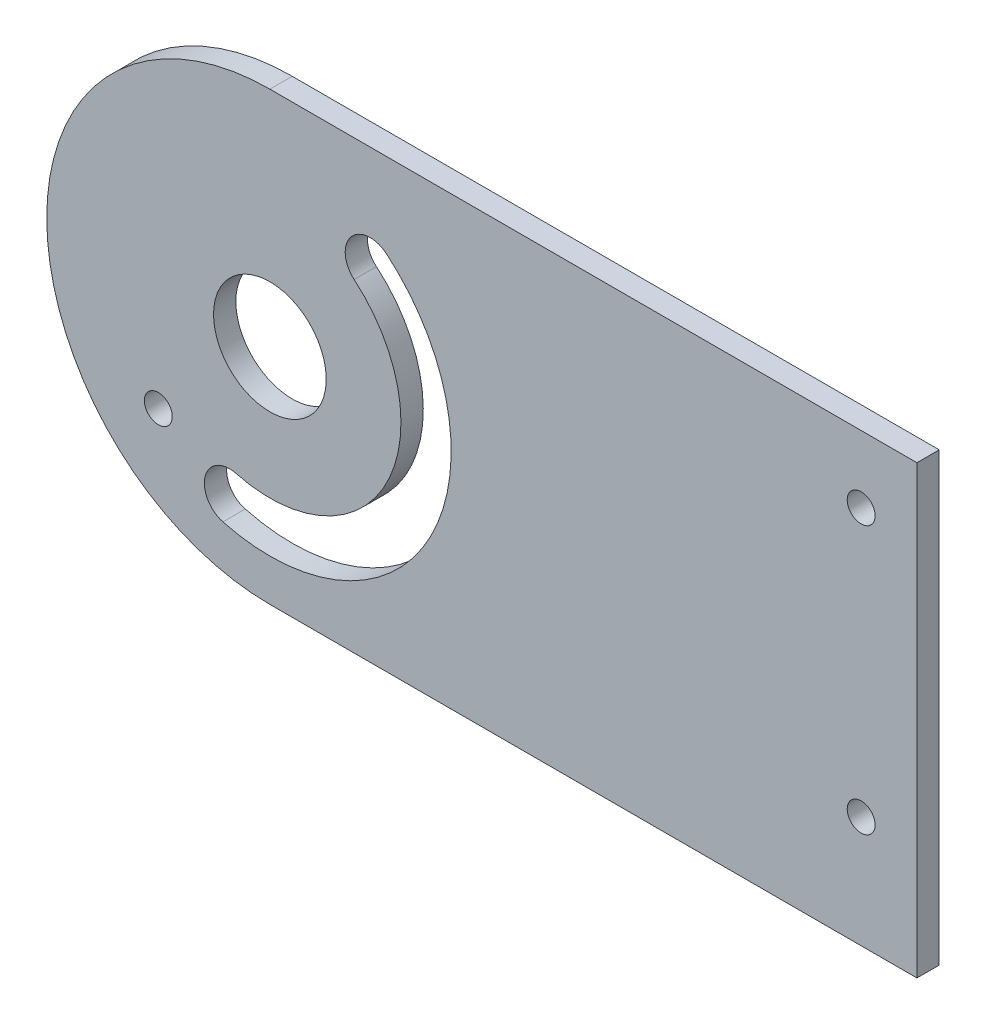
ISO-10303-21;
HEADER;
FILE_DESCRIPTION(('STEP AP214'),'2;1');
FILE_NAME('part.step','',(''),(''),'','','');
FILE_SCHEMA(('AUTOMOTIVE_DESIGN { 1 0 10303 214 1 1 1 1 }'));
ENDSEC;
DATA;
#1=APPLICATION_CONTEXT('core data for automotive mechanical design processes');
#2=APPLICATION_PROTOCOL_DEFINITION('international standard','automotive_design',2000,#1);
#3=PRODUCT_CONTEXT('',#1,'mechanical');
#4=PRODUCT('Part','Part','',(#3));
#5=PRODUCT_RELATED_PRODUCT_CATEGORY('part','',(#4));
#6=PRODUCT_DEFINITION_FORMATION('','',#4);
#7=PRODUCT_DEFINITION_CONTEXT('part definition',#1,'design');
#8=PRODUCT_DEFINITION('design','',#6,#7);
#9=PRODUCT_DEFINITION_SHAPE('','',#8);
#10=(LENGTH_UNIT() NAMED_UNIT(*) SI_UNIT(.MILLI.,.METRE.));
#11=(NAMED_UNIT(*) PLANE_ANGLE_UNIT() SI_UNIT($,.RADIAN.));
#12=(NAMED_UNIT(*) SI_UNIT($,.STERADIAN.) SOLID_ANGLE_UNIT());
#13=UNCERTAINTY_MEASURE_WITH_UNIT(LENGTH_MEASURE(1.E-05),#10,'distance_accuracy_value','');
#14=(GEOMETRIC_REPRESENTATION_CONTEXT(3) GLOBAL_UNCERTAINTY_ASSIGNED_CONTEXT((#13)) GLOBAL_UNIT_ASSIGNED_CONTEXT((#10,
#11,#12)) REPRESENTATION_CONTEXT('',''));
#15=CARTESIAN_POINT('',(0.,0.,0.));
#16=DIRECTION('',(0.,0.,1.));
#17=DIRECTION('',(1.,0.,0.));
#18=AXIS2_PLACEMENT_3D('',#15,#16,#17);
#19=CARTESIAN_POINT('',(78.,0.,2.));
#20=DIRECTION('',(0.,1.,0.));
#21=DIRECTION('',(-1.,0.,0.));
#22=AXIS2_PLACEMENT_3D('',#19,#20,#21);
#23=PLANE('',#22);
#24=DIRECTION('',(1.,0.,0.));
#25=VECTOR('',#24,1.);
#26=CARTESIAN_POINT('',(78.,0.,2.));
#27=LINE('',#26,#25);
#28=CARTESIAN_POINT('',(20.,0.,2.));
#29=VERTEX_POINT('',#28);
#30=CARTESIAN_POINT('',(78.,0.,2.));
#31=VERTEX_POINT('',#30);
#32=EDGE_CURVE('E187',#29,#31,#27,.T.);
#33=ORIENTED_EDGE('',*,*,#32,.F.);
#34=DIRECTION('',(0.,0.,-1.));
#35=VECTOR('',#34,1.);
#36=CARTESIAN_POINT('',(20.,0.,2.));
#37=LINE('',#36,#35);
#38=CARTESIAN_POINT('',(20.,0.,0.));
#39=VERTEX_POINT('',#38);
#40=EDGE_CURVE('E212',#29,#39,#37,.T.);
#41=ORIENTED_EDGE('',*,*,#40,.T.);
#42=DIRECTION('',(1.,0.,0.));
#43=VECTOR('',#42,1.);
#44=CARTESIAN_POINT('',(78.,0.,0.));
#45=LINE('',#44,#43);
#46=CARTESIAN_POINT('',(78.,0.,0.));
#47=VERTEX_POINT('',#46);
#48=EDGE_CURVE('E185',#39,#47,#45,.T.);
#49=ORIENTED_EDGE('',*,*,#48,.T.);
#50=DIRECTION('',(0.,0.,-1.));
#51=VECTOR('',#50,1.);
#52=CARTESIAN_POINT('',(78.,0.,2.));
#53=LINE('',#52,#51);
#54=EDGE_CURVE('E208',#31,#47,#53,.T.);
#55=ORIENTED_EDGE('',*,*,#54,.F.);
#56=EDGE_LOOP('',(#33,#41,#49,#55));
#57=FACE_BOUND('',#56,.T.);
#58=ADVANCED_FACE('F47',(#57),#23,.F.);
#59=CARTESIAN_POINT('',(78.,40.,2.));
#60=DIRECTION('',(-1.,0.,0.));
#61=DIRECTION('',(0.,0.,1.));
#62=AXIS2_PLACEMENT_3D('',#59,#60,#61);
#63=PLANE('',#62);
#64=DIRECTION('',(0.,1.,0.));
#65=VECTOR('',#64,1.);
#66=CARTESIAN_POINT('',(78.,40.,0.));
#67=LINE('',#66,#65);
#68=CARTESIAN_POINT('',(78.,40.,0.));
#69=VERTEX_POINT('',#68);
#70=EDGE_CURVE('E200',#47,#69,#67,.T.);
#71=ORIENTED_EDGE('',*,*,#70,.T.);
#72=DIRECTION('',(0.,0.,-1.));
#73=VECTOR('',#72,1.);
#74=CARTESIAN_POINT('',(78.,40.,2.));
#75=LINE('',#74,#73);
#76=CARTESIAN_POINT('',(78.,40.,2.));
#77=VERTEX_POINT('',#76);
#78=EDGE_CURVE('E197',#77,#69,#75,.T.);
#79=ORIENTED_EDGE('',*,*,#78,.F.);
#80=DIRECTION('',(0.,1.,0.));
#81=VECTOR('',#80,1.);
#82=CARTESIAN_POINT('',(78.,40.,2.));
#83=LINE('',#82,#81);
#84=EDGE_CURVE('E190',#31,#77,#83,.T.);
#85=ORIENTED_EDGE('',*,*,#84,.F.);
#86=ORIENTED_EDGE('',*,*,#54,.T.);
#87=EDGE_LOOP('',(#71,#79,#85,#86));
#88=FACE_BOUND('',#87,.T.);
#89=ADVANCED_FACE('F302',(#88),#63,.F.);
#90=CARTESIAN_POINT('',(0.,40.,2.));
#91=DIRECTION('',(0.,-1.,0.));
#92=DIRECTION('',(0.,0.,-1.));
#93=AXIS2_PLACEMENT_3D('',#90,#91,#92);
#94=PLANE('',#93);
#95=DIRECTION('',(-1.,0.,0.));
#96=VECTOR('',#95,1.);
#97=CARTESIAN_POINT('',(0.,40.,0.));
#98=LINE('',#97,#96);
#99=CARTESIAN_POINT('',(20.,40.,0.));
#100=VERTEX_POINT('',#99);
#101=EDGE_CURVE('E191',#69,#100,#98,.T.);
#102=ORIENTED_EDGE('',*,*,#101,.T.);
#103=DIRECTION('',(0.,0.,-1.));
#104=VECTOR('',#103,1.);
#105=CARTESIAN_POINT('',(20.,40.,2.));
#106=LINE('',#105,#104);
#107=CARTESIAN_POINT('',(20.,40.,2.));
#108=VERTEX_POINT('',#107);
#109=EDGE_CURVE('E11',#100,#108,#106,.F.);
#110=ORIENTED_EDGE('',*,*,#109,.T.);
#111=DIRECTION('',(-1.,0.,0.));
#112=VECTOR('',#111,1.);
#113=CARTESIAN_POINT('',(0.,40.,2.));
#114=LINE('',#113,#112);
#115=EDGE_CURVE('E194',#77,#108,#114,.T.);
#116=ORIENTED_EDGE('',*,*,#115,.F.);
#117=ORIENTED_EDGE('',*,*,#78,.T.);
#118=EDGE_LOOP('',(#102,#110,#116,#117));
#119=FACE_BOUND('',#118,.T.);
#120=ADVANCED_FACE('F281',(#119),#94,.F.);
#121=CARTESIAN_POINT('',(0.,0.,2.));
#122=DIRECTION('',(0.,0.,-1.));
#123=DIRECTION('',(-1.,0.,0.));
#124=AXIS2_PLACEMENT_3D('',#121,#122,#123);
#125=PLANE('',#124);
#126=CARTESIAN_POINT('',(73.,33.9999999999999,2.));
#127=DIRECTION('',(0.,0.,-1.));
#128=DIRECTION('',(-1.,0.,0.));
#129=AXIS2_PLACEMENT_3D('',#126,#127,#128);
#130=CIRCLE('',#129,1.25);
#131=CARTESIAN_POINT('',(71.75,33.9999999999999,2.));
#132=VERTEX_POINT('',#131);
#133=EDGE_CURVE('E182',#132,#132,#130,.T.);
#134=ORIENTED_EDGE('',*,*,#133,.T.);
#135=EDGE_LOOP('',(#134));
#136=FACE_BOUND('',#135,.T.);
#137=CARTESIAN_POINT('',(73.,9.99999999999999,2.));
#138=DIRECTION('',(0.,0.,-1.));
#139=DIRECTION('',(-1.,0.,0.));
#140=AXIS2_PLACEMENT_3D('',#137,#138,#139);
#141=CIRCLE('',#140,1.25);
#142=CARTESIAN_POINT('',(71.75,9.99999999999999,2.));
#143=VERTEX_POINT('',#142);
#144=EDGE_CURVE('E243',#143,#143,#141,.T.);
#145=ORIENTED_EDGE('',*,*,#144,.T.);
#146=EDGE_LOOP('',(#145));
#147=FACE_BOUND('',#146,.T.);
#148=CARTESIAN_POINT('',(10.0000000000681,10.2020410288673,2.));
#149=DIRECTION('',(0.,0.,-1.));
#150=DIRECTION('',(-1.,0.,0.));
#151=AXIS2_PLACEMENT_3D('',#148,#149,#150);
#152=CIRCLE('',#151,1.25000000006507);
#153=CARTESIAN_POINT('',(8.75000000000301,10.2020410288673,2.));
#154=VERTEX_POINT('',#153);
#155=EDGE_CURVE('E178',#154,#154,#152,.T.);
#156=ORIENTED_EDGE('',*,*,#155,.T.);
#157=EDGE_LOOP('',(#156));
#158=FACE_BOUND('',#157,.T.);
#159=CARTESIAN_POINT('',(20.0000000000681,20.,2.));
#160=DIRECTION('',(0.,0.,1.));
#161=DIRECTION('',(-1.,0.,0.));
#162=AXIS2_PLACEMENT_3D('',#159,#160,#161);
#163=CIRCLE('',#162,11.75);
#164=CARTESIAN_POINT('',(16.9578459977586,8.65064763846709,2.));
#165=VERTEX_POINT('',#164);
#166=CARTESIAN_POINT('',(27.5535714286395,29.0003365866766,2.));
#167=VERTEX_POINT('',#166);
#168=EDGE_CURVE('E161',#165,#167,#163,.T.);
#169=ORIENTED_EDGE('',*,*,#168,.T.);
#170=CARTESIAN_POINT('',(29.0000000000681,30.7238052947636,2.));
#171=DIRECTION('',(0.,0.,-1.));
#172=DIRECTION('',(-1.,0.,0.));
#173=AXIS2_PLACEMENT_3D('',#170,#171,#172);
#174=CIRCLE('',#173,2.25);
#175=CARTESIAN_POINT('',(30.4464285714966,32.4472740028506,2.));
#176=VERTEX_POINT('',#175);
#177=EDGE_CURVE('E126',#167,#176,#174,.T.);
#178=ORIENTED_EDGE('',*,*,#177,.T.);
#179=CARTESIAN_POINT('',(20.0000000000681,20.,2.));
#180=DIRECTION('',(0.,0.,-1.));
#181=DIRECTION('',(-1.,0.,0.));
#182=AXIS2_PLACEMENT_3D('',#179,#180,#181);
#183=CIRCLE('',#182,16.25);
#184=CARTESIAN_POINT('',(15.792765741555,4.30408715958214,2.));
#185=VERTEX_POINT('',#184);
#186=EDGE_CURVE('E169',#176,#185,#183,.T.);
#187=ORIENTED_EDGE('',*,*,#186,.T.);
#188=CARTESIAN_POINT('',(16.3753058696568,6.47736739902462,2.));
#189=DIRECTION('',(0.,0.,-1.));
#190=DIRECTION('',(-1.,0.,0.));
#191=AXIS2_PLACEMENT_3D('',#188,#189,#190);
#192=CIRCLE('',#191,2.25);
#193=EDGE_CURVE('E164',#185,#165,#192,.T.);
#194=ORIENTED_EDGE('',*,*,#193,.T.);
#195=EDGE_LOOP('',(#169,#178,#187,#194));
#196=FACE_BOUND('',#195,.T.);
#197=CARTESIAN_POINT('',(20.0000000000681,20.,2.));
#198=DIRECTION('',(0.,0.,-1.));
#199=DIRECTION('',(-1.,0.,0.));
#200=AXIS2_PLACEMENT_3D('',#197,#198,#199);
#201=CIRCLE('',#200,5.05000000006511);
#202=CARTESIAN_POINT('',(14.950000000003,20.,2.));
#203=VERTEX_POINT('',#202);
#204=EDGE_CURVE('E155',#203,#203,#201,.T.);
#205=ORIENTED_EDGE('',*,*,#204,.T.);
#206=EDGE_LOOP('',(#205));
#207=FACE_BOUND('',#206,.T.);
#208=CARTESIAN_POINT('',(20.,20.,2.));
#209=DIRECTION('',(0.,0.,-1.));
#210=DIRECTION('',(-1.,0.,0.));
#211=AXIS2_PLACEMENT_3D('',#208,#209,#210);
#212=CIRCLE('',#211,20.);
#213=CARTESIAN_POINT('',(0.,20.,2.));
#214=VERTEX_POINT('',#213);
#215=EDGE_CURVE('E64',#108,#214,#212,.F.);
#216=ORIENTED_EDGE('',*,*,#215,.T.);
#217=CARTESIAN_POINT('',(20.,20.,2.));
#218=DIRECTION('',(0.,0.,-1.));
#219=DIRECTION('',(-1.,0.,0.));
#220=AXIS2_PLACEMENT_3D('',#217,#218,#219);
#221=CIRCLE('',#220,20.);
#222=EDGE_CURVE('E57',#214,#29,#221,.F.);
#223=ORIENTED_EDGE('',*,*,#222,.T.);
#224=ORIENTED_EDGE('',*,*,#32,.T.);
#225=ORIENTED_EDGE('',*,*,#84,.T.);
#226=ORIENTED_EDGE('',*,*,#115,.T.);
#227=EDGE_LOOP('',(#216,#223,#224,#225,#226));
#228=FACE_BOUND('',#227,.T.);
#229=ADVANCED_FACE('F228',(#136,#147,#158,#196,#207,#228),#125,.F.);
#230=CARTESIAN_POINT('',(0.,0.,0.));
#231=DIRECTION('',(0.,0.,-1.));
#232=DIRECTION('',(-1.,0.,0.));
#233=AXIS2_PLACEMENT_3D('',#230,#231,#232);
#234=PLANE('',#233);
#235=CARTESIAN_POINT('',(73.,33.9999999999999,0.));
#236=DIRECTION('',(0.,0.,-1.));
#237=DIRECTION('',(-1.,0.,0.));
#238=AXIS2_PLACEMENT_3D('',#235,#236,#237);
#239=CIRCLE('',#238,1.275);
#240=CARTESIAN_POINT('',(71.725,33.9999999999999,0.));
#241=VERTEX_POINT('',#240);
#242=EDGE_CURVE('E443',#241,#241,#239,.T.);
#243=ORIENTED_EDGE('',*,*,#242,.F.);
#244=EDGE_LOOP('',(#243));
#245=FACE_BOUND('',#244,.T.);
#246=CARTESIAN_POINT('',(73.,9.99999999999999,0.));
#247=DIRECTION('',(0.,0.,-1.));
#248=DIRECTION('',(-1.,0.,0.));
#249=AXIS2_PLACEMENT_3D('',#246,#247,#248);
#250=CIRCLE('',#249,1.275);
#251=CARTESIAN_POINT('',(71.725,9.99999999999999,0.));
#252=VERTEX_POINT('',#251);
#253=EDGE_CURVE('E252',#252,#252,#250,.T.);
#254=ORIENTED_EDGE('',*,*,#253,.F.);
#255=EDGE_LOOP('',(#254));
#256=FACE_BOUND('',#255,.T.);
#257=CARTESIAN_POINT('',(10.0000000000681,10.2020410288673,0.));
#258=DIRECTION('',(0.,0.,-1.));
#259=DIRECTION('',(-1.,0.,0.));
#260=AXIS2_PLACEMENT_3D('',#257,#258,#259);
#261=CIRCLE('',#260,1.25000000006507);
#262=CARTESIAN_POINT('',(8.75000000000301,10.2020410288673,0.));
#263=VERTEX_POINT('',#262);
#264=EDGE_CURVE('E132',#263,#263,#261,.T.);
#265=ORIENTED_EDGE('',*,*,#264,.F.);
#266=EDGE_LOOP('',(#265));
#267=FACE_BOUND('',#266,.T.);
#268=CARTESIAN_POINT('',(29.0000000000681,30.7238052947636,0.));
#269=DIRECTION('',(0.,0.,-1.));
#270=DIRECTION('',(-1.,0.,0.));
#271=AXIS2_PLACEMENT_3D('',#268,#269,#270);
#272=CIRCLE('',#271,2.25);
#273=CARTESIAN_POINT('',(27.5535714286395,29.0003365866766,0.));
#274=VERTEX_POINT('',#273);
#275=CARTESIAN_POINT('',(30.4464285714966,32.4472740028506,0.));
#276=VERTEX_POINT('',#275);
#277=EDGE_CURVE('E123',#274,#276,#272,.T.);
#278=ORIENTED_EDGE('',*,*,#277,.F.);
#279=CARTESIAN_POINT('',(20.0000000000681,20.,0.));
#280=DIRECTION('',(0.,0.,1.));
#281=DIRECTION('',(-1.,0.,0.));
#282=AXIS2_PLACEMENT_3D('',#279,#280,#281);
#283=CIRCLE('',#282,11.75);
#284=CARTESIAN_POINT('',(16.9578459977586,8.65064763846709,0.));
#285=VERTEX_POINT('',#284);
#286=EDGE_CURVE('E135',#285,#274,#283,.T.);
#287=ORIENTED_EDGE('',*,*,#286,.F.);
#288=CARTESIAN_POINT('',(16.3753058696568,6.47736739902462,0.));
#289=DIRECTION('',(0.,0.,-1.));
#290=DIRECTION('',(-1.,0.,0.));
#291=AXIS2_PLACEMENT_3D('',#288,#289,#290);
#292=CIRCLE('',#291,2.25);
#293=CARTESIAN_POINT('',(15.792765741555,4.30408715958214,0.));
#294=VERTEX_POINT('',#293);
#295=EDGE_CURVE('E141',#294,#285,#292,.T.);
#296=ORIENTED_EDGE('',*,*,#295,.F.);
#297=CARTESIAN_POINT('',(20.0000000000681,20.,0.));
#298=DIRECTION('',(0.,0.,-1.));
#299=DIRECTION('',(-1.,0.,0.));
#300=AXIS2_PLACEMENT_3D('',#297,#298,#299);
#301=CIRCLE('',#300,16.25);
#302=EDGE_CURVE('E147',#276,#294,#301,.T.);
#303=ORIENTED_EDGE('',*,*,#302,.F.);
#304=EDGE_LOOP('',(#278,#287,#296,#303));
#305=FACE_BOUND('',#304,.T.);
#306=CARTESIAN_POINT('',(20.0000000000681,20.,0.));
#307=DIRECTION('',(0.,0.,-1.));
#308=DIRECTION('',(-1.,0.,0.));
#309=AXIS2_PLACEMENT_3D('',#306,#307,#308);
#310=CIRCLE('',#309,5.05000000006511);
#311=CARTESIAN_POINT('',(14.950000000003,20.,0.));
#312=VERTEX_POINT('',#311);
#313=EDGE_CURVE('E149',#312,#312,#310,.T.);
#314=ORIENTED_EDGE('',*,*,#313,.F.);
#315=EDGE_LOOP('',(#314));
#316=FACE_BOUND('',#315,.T.);
#317=ORIENTED_EDGE('',*,*,#48,.F.);
#318=CARTESIAN_POINT('',(20.,20.,0.));
#319=DIRECTION('',(0.,0.,-1.));
#320=DIRECTION('',(-1.,0.,0.));
#321=AXIS2_PLACEMENT_3D('',#318,#319,#320);
#322=CIRCLE('',#321,20.);
#323=CARTESIAN_POINT('',(0.,20.,0.));
#324=VERTEX_POINT('',#323);
#325=EDGE_CURVE('E219',#39,#324,#322,.T.);
#326=ORIENTED_EDGE('',*,*,#325,.T.);
#327=CARTESIAN_POINT('',(20.,20.,0.));
#328=DIRECTION('',(0.,0.,-1.));
#329=DIRECTION('',(-1.,0.,0.));
#330=AXIS2_PLACEMENT_3D('',#327,#328,#329);
#331=CIRCLE('',#330,20.);
#332=EDGE_CURVE('E216',#324,#100,#331,.T.);
#333=ORIENTED_EDGE('',*,*,#332,.T.);
#334=ORIENTED_EDGE('',*,*,#101,.F.);
#335=ORIENTED_EDGE('',*,*,#70,.F.);
#336=EDGE_LOOP('',(#317,#326,#333,#334,#335));
#337=FACE_BOUND('',#336,.T.);
#338=ADVANCED_FACE('F144',(#245,#256,#267,#305,#316,#337),#234,.T.);
#339=CARTESIAN_POINT('',(20.0000000000681,20.,2.));
#340=DIRECTION('',(0.,0.,-1.));
#341=DIRECTION('',(-1.,0.,0.));
#342=AXIS2_PLACEMENT_3D('',#339,#340,#341);
#343=CYLINDRICAL_SURFACE('',#342,5.05000000006511);
#344=ORIENTED_EDGE('',*,*,#204,.F.);
#345=EDGE_LOOP('',(#344));
#346=FACE_BOUND('',#345,.T.);
#347=ORIENTED_EDGE('',*,*,#313,.T.);
#348=EDGE_LOOP('',(#347));
#349=FACE_BOUND('',#348,.T.);
#350=ADVANCED_FACE('F286',(#346,#349),#343,.F.);
#351=CARTESIAN_POINT('',(29.0000000000681,30.7238052947636,2.));
#352=DIRECTION('',(0.,0.,-1.));
#353=DIRECTION('',(-1.,0.,0.));
#354=AXIS2_PLACEMENT_3D('',#351,#352,#353);
#355=CYLINDRICAL_SURFACE('',#354,2.25);
#356=ORIENTED_EDGE('',*,*,#277,.T.);
#357=DIRECTION('',(0.,0.,-1.));
#358=VECTOR('',#357,1.);
#359=CARTESIAN_POINT('',(30.4464285714966,32.4472740028506,2.));
#360=LINE('',#359,#358);
#361=EDGE_CURVE('E165',#176,#276,#360,.T.);
#362=ORIENTED_EDGE('',*,*,#361,.F.);
#363=ORIENTED_EDGE('',*,*,#177,.F.);
#364=DIRECTION('',(0.,0.,-1.));
#365=VECTOR('',#364,1.);
#366=CARTESIAN_POINT('',(27.5535714286395,29.0003365866766,2.));
#367=LINE('',#366,#365);
#368=EDGE_CURVE('E119',#167,#274,#367,.T.);
#369=ORIENTED_EDGE('',*,*,#368,.T.);
#370=EDGE_LOOP('',(#356,#362,#363,#369));
#371=FACE_BOUND('',#370,.T.);
#372=ADVANCED_FACE('F121',(#371),#355,.F.);
#373=CARTESIAN_POINT('',(20.0000000000681,20.,2.));
#374=DIRECTION('',(0.,0.,-1.));
#375=DIRECTION('',(-1.,0.,0.));
#376=AXIS2_PLACEMENT_3D('',#373,#374,#375);
#377=CYLINDRICAL_SURFACE('',#376,11.75);
#378=ORIENTED_EDGE('',*,*,#286,.T.);
#379=ORIENTED_EDGE('',*,*,#368,.F.);
#380=ORIENTED_EDGE('',*,*,#168,.F.);
#381=DIRECTION('',(0.,0.,-1.));
#382=VECTOR('',#381,1.);
#383=CARTESIAN_POINT('',(16.9578459977586,8.65064763846709,2.));
#384=LINE('',#383,#382);
#385=EDGE_CURVE('E131',#165,#285,#384,.T.);
#386=ORIENTED_EDGE('',*,*,#385,.T.);
#387=EDGE_LOOP('',(#378,#379,#380,#386));
#388=FACE_BOUND('',#387,.T.);
#389=ADVANCED_FACE('F136',(#388),#377,.T.);
#390=CARTESIAN_POINT('',(16.3753058696568,6.47736739902462,2.));
#391=DIRECTION('',(0.,0.,-1.));
#392=DIRECTION('',(-1.,0.,0.));
#393=AXIS2_PLACEMENT_3D('',#390,#391,#392);
#394=CYLINDRICAL_SURFACE('',#393,2.25);
#395=ORIENTED_EDGE('',*,*,#295,.T.);
#396=ORIENTED_EDGE('',*,*,#385,.F.);
#397=ORIENTED_EDGE('',*,*,#193,.F.);
#398=DIRECTION('',(0.,0.,-1.));
#399=VECTOR('',#398,1.);
#400=CARTESIAN_POINT('',(15.792765741555,4.30408715958214,2.));
#401=LINE('',#400,#399);
#402=EDGE_CURVE('E266',#185,#294,#401,.T.);
#403=ORIENTED_EDGE('',*,*,#402,.T.);
#404=EDGE_LOOP('',(#395,#396,#397,#403));
#405=FACE_BOUND('',#404,.T.);
#406=ADVANCED_FACE('F273',(#405),#394,.F.);
#407=CARTESIAN_POINT('',(20.0000000000681,20.,2.));
#408=DIRECTION('',(0.,0.,-1.));
#409=DIRECTION('',(-1.,0.,0.));
#410=AXIS2_PLACEMENT_3D('',#407,#408,#409);
#411=CYLINDRICAL_SURFACE('',#410,16.25);
#412=ORIENTED_EDGE('',*,*,#302,.T.);
#413=ORIENTED_EDGE('',*,*,#402,.F.);
#414=ORIENTED_EDGE('',*,*,#186,.F.);
#415=ORIENTED_EDGE('',*,*,#361,.T.);
#416=EDGE_LOOP('',(#412,#413,#414,#415));
#417=FACE_BOUND('',#416,.T.);
#418=ADVANCED_FACE('F277',(#417),#411,.F.);
#419=CARTESIAN_POINT('',(10.0000000000681,10.2020410288673,2.));
#420=DIRECTION('',(0.,0.,-1.));
#421=DIRECTION('',(-1.,0.,0.));
#422=AXIS2_PLACEMENT_3D('',#419,#420,#421);
#423=CYLINDRICAL_SURFACE('',#422,1.25000000006507);
#424=ORIENTED_EDGE('',*,*,#155,.F.);
#425=EDGE_LOOP('',(#424));
#426=FACE_BOUND('',#425,.T.);
#427=ORIENTED_EDGE('',*,*,#264,.T.);
#428=EDGE_LOOP('',(#427));
#429=FACE_BOUND('',#428,.T.);
#430=ADVANCED_FACE('F328',(#426,#429),#423,.F.);
#431=CARTESIAN_POINT('',(73.,9.99999999999999,2.));
#432=DIRECTION('',(0.,0.,-1.));
#433=DIRECTION('',(-1.,0.,0.));
#434=AXIS2_PLACEMENT_3D('',#431,#432,#433);
#435=CYLINDRICAL_SURFACE('',#434,1.25);
#436=CARTESIAN_POINT('',(73.,9.99999999999999,0.0250000000000007));
#437=DIRECTION('',(0.,0.,-1.));
#438=DIRECTION('',(-1.,0.,0.));
#439=AXIS2_PLACEMENT_3D('',#436,#437,#438);
#440=CIRCLE('',#439,1.25);
#441=CARTESIAN_POINT('',(71.75,9.99999999999999,0.0250000000000007));
#442=VERTEX_POINT('',#441);
#443=EDGE_CURVE('E244',#442,#442,#440,.T.);
#444=ORIENTED_EDGE('',*,*,#443,.T.);
#445=EDGE_LOOP('',(#444));
#446=FACE_BOUND('',#445,.T.);
#447=ORIENTED_EDGE('',*,*,#144,.F.);
#448=EDGE_LOOP('',(#447));
#449=FACE_BOUND('',#448,.T.);
#450=ADVANCED_FACE('F323',(#446,#449),#435,.F.);
#451=CARTESIAN_POINT('',(73.,33.9999999999999,2.));
#452=DIRECTION('',(0.,0.,-1.));
#453=DIRECTION('',(-1.,0.,0.));
#454=AXIS2_PLACEMENT_3D('',#451,#452,#453);
#455=CYLINDRICAL_SURFACE('',#454,1.25);
#456=CARTESIAN_POINT('',(73.,33.9999999999999,0.0250000000000007));
#457=DIRECTION('',(0.,0.,-1.));
#458=DIRECTION('',(-1.,0.,0.));
#459=AXIS2_PLACEMENT_3D('',#456,#457,#458);
#460=CIRCLE('',#459,1.25);
#461=CARTESIAN_POINT('',(71.75,33.9999999999999,0.0250000000000007));
#462=VERTEX_POINT('',#461);
#463=EDGE_CURVE('E259',#462,#462,#460,.T.);
#464=ORIENTED_EDGE('',*,*,#463,.T.);
#465=EDGE_LOOP('',(#464));
#466=FACE_BOUND('',#465,.T.);
#467=ORIENTED_EDGE('',*,*,#133,.F.);
#468=EDGE_LOOP('',(#467));
#469=FACE_BOUND('',#468,.T.);
#470=ADVANCED_FACE('F319',(#466,#469),#455,.F.);
#471=CARTESIAN_POINT('',(20.,20.,2.));
#472=DIRECTION('',(0.,0.,-1.));
#473=DIRECTION('',(-1.,0.,0.));
#474=AXIS2_PLACEMENT_3D('',#471,#472,#473);
#475=CYLINDRICAL_SURFACE('',#474,20.);
#476=DIRECTION('',(0.,0.,-1.));
#477=VECTOR('',#476,1.);
#478=CARTESIAN_POINT('',(0.,20.,2.));
#479=LINE('',#478,#477);
#480=EDGE_CURVE('E51',#214,#324,#479,.T.);
#481=ORIENTED_EDGE('',*,*,#480,.F.);
#482=ORIENTED_EDGE('',*,*,#215,.F.);
#483=ORIENTED_EDGE('',*,*,#109,.F.);
#484=ORIENTED_EDGE('',*,*,#332,.F.);
#485=EDGE_LOOP('',(#481,#482,#483,#484));
#486=FACE_BOUND('',#485,.T.);
#487=ADVANCED_FACE('F49',(#486),#475,.T.);
#488=CARTESIAN_POINT('',(20.,20.,2.));
#489=DIRECTION('',(0.,0.,-1.));
#490=DIRECTION('',(-1.,0.,0.));
#491=AXIS2_PLACEMENT_3D('',#488,#489,#490);
#492=CYLINDRICAL_SURFACE('',#491,20.);
#493=ORIENTED_EDGE('',*,*,#222,.F.);
#494=ORIENTED_EDGE('',*,*,#480,.T.);
#495=ORIENTED_EDGE('',*,*,#325,.F.);
#496=ORIENTED_EDGE('',*,*,#40,.F.);
#497=EDGE_LOOP('',(#493,#494,#495,#496));
#498=FACE_BOUND('',#497,.T.);
#499=ADVANCED_FACE('F236',(#498),#492,.T.);
#500=CARTESIAN_POINT('',(73.,9.99999999999999,0.));
#501=DIRECTION('',(0.,0.,-1.));
#502=DIRECTION('',(-1.,0.,0.));
#503=AXIS2_PLACEMENT_3D('',#500,#501,#502);
#504=CONICAL_SURFACE('',#503,1.275,0.785398163397379);
#505=ORIENTED_EDGE('',*,*,#443,.F.);
#506=EDGE_LOOP('',(#505));
#507=FACE_BOUND('',#506,.T.);
#508=ORIENTED_EDGE('',*,*,#253,.T.);
#509=EDGE_LOOP('',(#508));
#510=FACE_BOUND('',#509,.T.);
#511=ADVANCED_FACE('F311',(#507,#510),#504,.F.);
#512=CARTESIAN_POINT('',(73.,33.9999999999999,0.));
#513=DIRECTION('',(0.,0.,-1.));
#514=DIRECTION('',(-1.,0.,0.));
#515=AXIS2_PLACEMENT_3D('',#512,#513,#514);
#516=CONICAL_SURFACE('',#515,1.275,0.785398163397379);
#517=ORIENTED_EDGE('',*,*,#463,.F.);
#518=EDGE_LOOP('',(#517));
#519=FACE_BOUND('',#518,.T.);
#520=ORIENTED_EDGE('',*,*,#242,.T.);
#521=EDGE_LOOP('',(#520));
#522=FACE_BOUND('',#521,.T.);
#523=ADVANCED_FACE('F316',(#519,#522),#516,.F.);
#524=CLOSED_SHELL('',(#58,#89,#120,#229,#338,#350,#372,#389,#406,#418,#430,#450,#470,#487,#499,
#511,#523));
#525=MANIFOLD_SOLID_BREP('B2',#524);
#526=ADVANCED_BREP_SHAPE_REPRESENTATION('',(#18,#525),#14);
#527=SHAPE_DEFINITION_REPRESENTATION(#9,#526);
ENDSEC;
END-ISO-10303-21;
